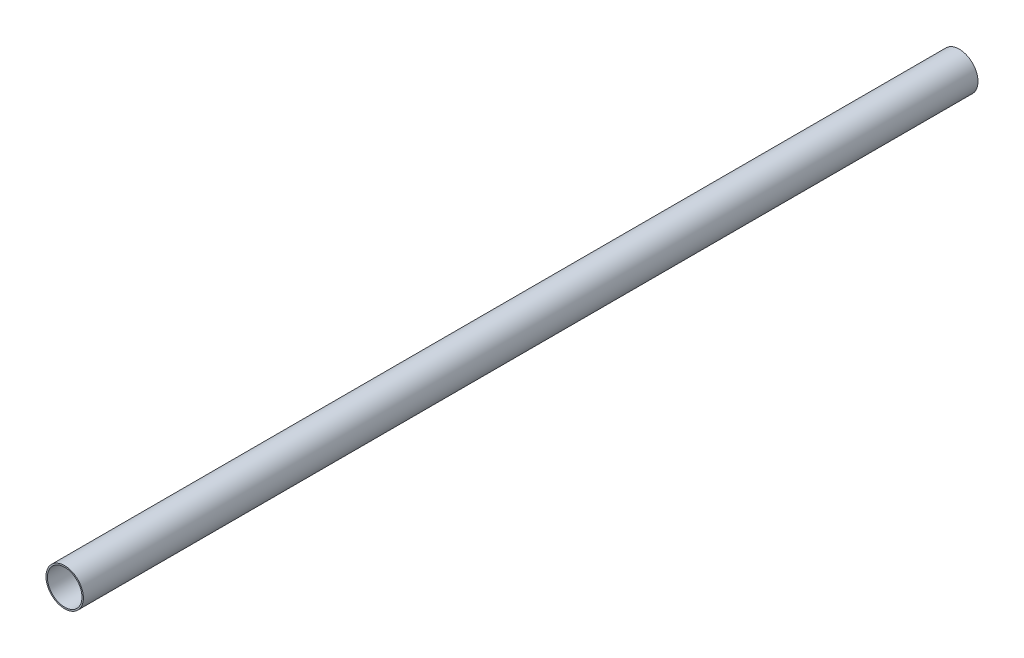
ISO-10303-21;
HEADER;
FILE_DESCRIPTION(('STEP AP214'),'2;1');
FILE_NAME('part.step','',(''),(''),'','','');
FILE_SCHEMA(('AUTOMOTIVE_DESIGN { 1 0 10303 214 1 1 1 1 }'));
ENDSEC;
DATA;
#1=APPLICATION_CONTEXT('core data for automotive mechanical design processes');
#2=APPLICATION_PROTOCOL_DEFINITION('international standard','automotive_design',2000,#1);
#3=PRODUCT_CONTEXT('',#1,'mechanical');
#4=PRODUCT('Part','Part','',(#3));
#5=PRODUCT_RELATED_PRODUCT_CATEGORY('part','',(#4));
#6=PRODUCT_DEFINITION_FORMATION('','',#4);
#7=PRODUCT_DEFINITION_CONTEXT('part definition',#1,'design');
#8=PRODUCT_DEFINITION('design','',#6,#7);
#9=PRODUCT_DEFINITION_SHAPE('','',#8);
#10=(LENGTH_UNIT() NAMED_UNIT(*) SI_UNIT(.MILLI.,.METRE.));
#11=(NAMED_UNIT(*) PLANE_ANGLE_UNIT() SI_UNIT($,.RADIAN.));
#12=(NAMED_UNIT(*) SI_UNIT($,.STERADIAN.) SOLID_ANGLE_UNIT());
#13=UNCERTAINTY_MEASURE_WITH_UNIT(LENGTH_MEASURE(1.E-05),#10,'distance_accuracy_value','');
#14=(GEOMETRIC_REPRESENTATION_CONTEXT(3) GLOBAL_UNCERTAINTY_ASSIGNED_CONTEXT((#13)) GLOBAL_UNIT_ASSIGNED_CONTEXT((#10,
#11,#12)) REPRESENTATION_CONTEXT('',''));
#15=CARTESIAN_POINT('',(0.,0.,0.));
#16=DIRECTION('',(0.,0.,1.));
#17=DIRECTION('',(1.,0.,0.));
#18=AXIS2_PLACEMENT_3D('',#15,#16,#17);
#19=CARTESIAN_POINT('',(0.,0.,765.));
#20=DIRECTION('',(0.,0.,1.));
#21=DIRECTION('',(1.,0.,0.));
#22=AXIS2_PLACEMENT_3D('',#19,#20,#21);
#23=PLANE('',#22);
#24=CARTESIAN_POINT('',(0.,0.,765.));
#25=DIRECTION('',(0.,0.,1.));
#26=DIRECTION('',(1.,0.,0.));
#27=AXIS2_PLACEMENT_3D('',#24,#25,#26);
#28=CIRCLE('',#27,16.);
#29=CARTESIAN_POINT('',(16.,0.,765.));
#30=VERTEX_POINT('',#29);
#31=EDGE_CURVE('E12',#30,#30,#28,.T.);
#32=ORIENTED_EDGE('',*,*,#31,.T.);
#33=EDGE_LOOP('',(#32));
#34=FACE_BOUND('',#33,.T.);
#35=CARTESIAN_POINT('',(0.,0.,765.));
#36=DIRECTION('',(0.,0.,1.));
#37=DIRECTION('',(1.,0.,0.));
#38=AXIS2_PLACEMENT_3D('',#35,#36,#37);
#39=CIRCLE('',#38,14.8);
#40=CARTESIAN_POINT('',(14.8,0.,765.));
#41=VERTEX_POINT('',#40);
#42=EDGE_CURVE('E51',#41,#41,#39,.T.);
#43=ORIENTED_EDGE('',*,*,#42,.F.);
#44=EDGE_LOOP('',(#43));
#45=FACE_BOUND('',#44,.T.);
#46=ADVANCED_FACE('F40',(#34,#45),#23,.T.);
#47=CARTESIAN_POINT('',(0.,0.,0.));
#48=DIRECTION('',(0.,0.,1.));
#49=DIRECTION('',(1.,0.,0.));
#50=AXIS2_PLACEMENT_3D('',#47,#48,#49);
#51=PLANE('',#50);
#52=CARTESIAN_POINT('',(0.,0.,0.));
#53=DIRECTION('',(0.,0.,1.));
#54=DIRECTION('',(1.,0.,0.));
#55=AXIS2_PLACEMENT_3D('',#52,#53,#54);
#56=CIRCLE('',#55,16.);
#57=CARTESIAN_POINT('',(16.,0.,0.));
#58=VERTEX_POINT('',#57);
#59=EDGE_CURVE('E44',#58,#58,#56,.T.);
#60=ORIENTED_EDGE('',*,*,#59,.F.);
#61=EDGE_LOOP('',(#60));
#62=FACE_BOUND('',#61,.T.);
#63=CARTESIAN_POINT('',(0.,0.,0.));
#64=DIRECTION('',(0.,0.,1.));
#65=DIRECTION('',(1.,0.,0.));
#66=AXIS2_PLACEMENT_3D('',#63,#64,#65);
#67=CIRCLE('',#66,14.8);
#68=CARTESIAN_POINT('',(14.8,0.,0.));
#69=VERTEX_POINT('',#68);
#70=EDGE_CURVE('E53',#69,#69,#67,.T.);
#71=ORIENTED_EDGE('',*,*,#70,.T.);
#72=EDGE_LOOP('',(#71));
#73=FACE_BOUND('',#72,.T.);
#74=ADVANCED_FACE('F63',(#62,#73),#51,.F.);
#75=CARTESIAN_POINT('',(0.,0.,765.));
#76=DIRECTION('',(0.,0.,-1.));
#77=DIRECTION('',(-1.,0.,0.));
#78=AXIS2_PLACEMENT_3D('',#75,#76,#77);
#79=CYLINDRICAL_SURFACE('',#78,16.);
#80=ORIENTED_EDGE('',*,*,#31,.F.);
#81=EDGE_LOOP('',(#80));
#82=FACE_BOUND('',#81,.T.);
#83=ORIENTED_EDGE('',*,*,#59,.T.);
#84=EDGE_LOOP('',(#83));
#85=FACE_BOUND('',#84,.T.);
#86=ADVANCED_FACE('F42',(#82,#85),#79,.T.);
#87=CARTESIAN_POINT('',(0.,0.,765.));
#88=DIRECTION('',(0.,0.,-1.));
#89=DIRECTION('',(-1.,0.,0.));
#90=AXIS2_PLACEMENT_3D('',#87,#88,#89);
#91=CYLINDRICAL_SURFACE('',#90,14.8);
#92=ORIENTED_EDGE('',*,*,#42,.T.);
#93=EDGE_LOOP('',(#92));
#94=FACE_BOUND('',#93,.T.);
#95=ORIENTED_EDGE('',*,*,#70,.F.);
#96=EDGE_LOOP('',(#95));
#97=FACE_BOUND('',#96,.T.);
#98=ADVANCED_FACE('F59',(#94,#97),#91,.F.);
#99=CLOSED_SHELL('',(#46,#74,#86,#98));
#100=MANIFOLD_SOLID_BREP('B2',#99);
#101=ADVANCED_BREP_SHAPE_REPRESENTATION('',(#18,#100),#14);
#102=SHAPE_DEFINITION_REPRESENTATION(#9,#101);
ENDSEC;
END-ISO-10303-21;
